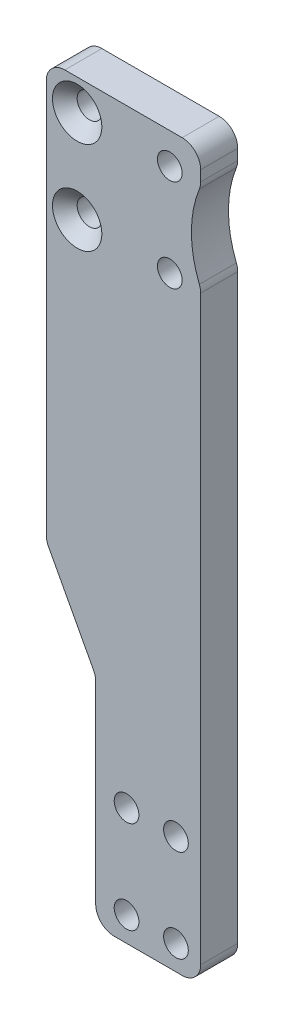
ISO-10303-21;
HEADER;
FILE_DESCRIPTION(('STEP AP214'),'2;1');
FILE_NAME('part.step','',(''),(''),'','','');
FILE_SCHEMA(('AUTOMOTIVE_DESIGN { 1 0 10303 214 1 1 1 1 }'));
ENDSEC;
DATA;
#1=APPLICATION_CONTEXT('core data for automotive mechanical design processes');
#2=APPLICATION_PROTOCOL_DEFINITION('international standard','automotive_design',2000,#1);
#3=PRODUCT_CONTEXT('',#1,'mechanical');
#4=PRODUCT('Part','Part','',(#3));
#5=PRODUCT_RELATED_PRODUCT_CATEGORY('part','',(#4));
#6=PRODUCT_DEFINITION_FORMATION('','',#4);
#7=PRODUCT_DEFINITION_CONTEXT('part definition',#1,'design');
#8=PRODUCT_DEFINITION('design','',#6,#7);
#9=PRODUCT_DEFINITION_SHAPE('','',#8);
#10=(LENGTH_UNIT() NAMED_UNIT(*) SI_UNIT(.MILLI.,.METRE.));
#11=(NAMED_UNIT(*) PLANE_ANGLE_UNIT() SI_UNIT($,.RADIAN.));
#12=(NAMED_UNIT(*) SI_UNIT($,.STERADIAN.) SOLID_ANGLE_UNIT());
#13=UNCERTAINTY_MEASURE_WITH_UNIT(LENGTH_MEASURE(1.E-05),#10,'distance_accuracy_value','');
#14=(GEOMETRIC_REPRESENTATION_CONTEXT(3) GLOBAL_UNCERTAINTY_ASSIGNED_CONTEXT((#13)) GLOBAL_UNIT_ASSIGNED_CONTEXT((#10,
#11,#12)) REPRESENTATION_CONTEXT('',''));
#15=CARTESIAN_POINT('',(0.,0.,0.));
#16=DIRECTION('',(0.,0.,1.));
#17=DIRECTION('',(1.,0.,0.));
#18=AXIS2_PLACEMENT_3D('',#15,#16,#17);
#19=CARTESIAN_POINT('',(0.,0.,6.));
#20=DIRECTION('',(0.,0.,1.));
#21=DIRECTION('',(1.,0.,0.));
#22=AXIS2_PLACEMENT_3D('',#19,#20,#21);
#23=PLANE('',#22);
#24=CARTESIAN_POINT('',(-2.00000000000001,107.5,6.));
#25=DIRECTION('',(0.,0.,1.));
#26=DIRECTION('',(1.,0.,0.));
#27=AXIS2_PLACEMENT_3D('',#24,#25,#26);
#28=CIRCLE('',#27,4.00000000000003);
#29=CARTESIAN_POINT('',(2.00000000000002,107.5,6.));
#30=VERTEX_POINT('',#29);
#31=EDGE_CURVE('E92',#30,#30,#28,.F.);
#32=ORIENTED_EDGE('',*,*,#31,.T.);
#33=EDGE_LOOP('',(#32));
#34=FACE_BOUND('',#33,.T.);
#35=CARTESIAN_POINT('',(-2.00000000000001,92.5,6.));
#36=DIRECTION('',(0.,0.,1.));
#37=DIRECTION('',(1.,0.,0.));
#38=AXIS2_PLACEMENT_3D('',#35,#36,#37);
#39=CIRCLE('',#38,4.00000000000003);
#40=CARTESIAN_POINT('',(2.00000000000002,92.5,6.));
#41=VERTEX_POINT('',#40);
#42=EDGE_CURVE('E326',#41,#41,#39,.F.);
#43=ORIENTED_EDGE('',*,*,#42,.T.);
#44=EDGE_LOOP('',(#43));
#45=FACE_BOUND('',#44,.T.);
#46=DIRECTION('',(0.,1.,0.));
#47=VECTOR('',#46,1.);
#48=CARTESIAN_POINT('',(0.999999999999982,30.,6.));
#49=LINE('',#48,#47);
#50=CARTESIAN_POINT('',(0.999999999999986,-1.99999999999999,6.));
#51=VERTEX_POINT('',#50);
#52=CARTESIAN_POINT('',(0.999999999999982,29.25,6.));
#53=VERTEX_POINT('',#52);
#54=EDGE_CURVE('E468',#51,#53,#49,.T.);
#55=ORIENTED_EDGE('',*,*,#54,.F.);
#56=CARTESIAN_POINT('',(3.99999999999999,-1.99999999999999,6.));
#57=DIRECTION('',(0.,0.,1.));
#58=DIRECTION('',(1.,0.,0.));
#59=AXIS2_PLACEMENT_3D('',#56,#57,#58);
#60=CIRCLE('',#59,3.);
#61=CARTESIAN_POINT('',(3.99999999999999,-5.,6.));
#62=VERTEX_POINT('',#61);
#63=EDGE_CURVE('E306',#51,#62,#60,.T.);
#64=ORIENTED_EDGE('',*,*,#63,.T.);
#65=DIRECTION('',(1.,0.,0.));
#66=VECTOR('',#65,1.);
#67=CARTESIAN_POINT('',(0.,-5.,6.));
#68=LINE('',#67,#66);
#69=CARTESIAN_POINT('',(15.,-5.,6.));
#70=VERTEX_POINT('',#69);
#71=EDGE_CURVE('E252',#62,#70,#68,.T.);
#72=ORIENTED_EDGE('',*,*,#71,.T.);
#73=CARTESIAN_POINT('',(15.,-2.,6.));
#74=DIRECTION('',(0.,0.,1.));
#75=DIRECTION('',(1.,0.,0.));
#76=AXIS2_PLACEMENT_3D('',#73,#74,#75);
#77=CIRCLE('',#76,3.);
#78=CARTESIAN_POINT('',(18.,-1.99999999999999,6.));
#79=VERTEX_POINT('',#78);
#80=EDGE_CURVE('E266',#70,#79,#77,.T.);
#81=ORIENTED_EDGE('',*,*,#80,.T.);
#82=DIRECTION('',(0.,-1.,0.));
#83=VECTOR('',#82,1.);
#84=CARTESIAN_POINT('',(18.,0.,6.));
#85=LINE('',#84,#83);
#86=CARTESIAN_POINT('',(18.,92.20577136594,6.));
#87=VERTEX_POINT('',#86);
#88=EDGE_CURVE('E243',#87,#79,#85,.T.);
#89=ORIENTED_EDGE('',*,*,#88,.F.);
#90=CARTESIAN_POINT('',(15.,92.20577136594,6.));
#91=DIRECTION('',(0.,0.,1.));
#92=DIRECTION('',(1.,0.,0.));
#93=AXIS2_PLACEMENT_3D('',#90,#91,#92);
#94=CIRCLE('',#93,3.);
#95=CARTESIAN_POINT('',(17.7857142857143,93.3192325993771,6.));
#96=VERTEX_POINT('',#95);
#97=EDGE_CURVE('E268',#87,#96,#94,.T.);
#98=ORIENTED_EDGE('',*,*,#97,.T.);
#99=CARTESIAN_POINT('',(34.5,100.,6.));
#100=DIRECTION('',(0.,0.,1.));
#101=DIRECTION('',(1.,0.,0.));
#102=AXIS2_PLACEMENT_3D('',#99,#100,#101);
#103=CIRCLE('',#102,18.);
#104=CARTESIAN_POINT('',(17.7857142857143,106.680767400623,6.));
#105=VERTEX_POINT('',#104);
#106=EDGE_CURVE('E442',#105,#96,#103,.T.);
#107=ORIENTED_EDGE('',*,*,#106,.F.);
#108=CARTESIAN_POINT('',(15.,107.79422863406,6.));
#109=DIRECTION('',(0.,0.,1.));
#110=DIRECTION('',(1.,0.,0.));
#111=AXIS2_PLACEMENT_3D('',#108,#109,#110);
#112=CIRCLE('',#111,3.);
#113=CARTESIAN_POINT('',(18.,107.79422863406,6.));
#114=VERTEX_POINT('',#113);
#115=EDGE_CURVE('E270',#105,#114,#112,.T.);
#116=ORIENTED_EDGE('',*,*,#115,.T.);
#117=CARTESIAN_POINT('',(18.,109.5,6.));
#118=VERTEX_POINT('',#117);
#119=EDGE_CURVE('E430',#118,#114,#85,.T.);
#120=ORIENTED_EDGE('',*,*,#119,.F.);
#121=CARTESIAN_POINT('',(15.,109.5,6.));
#122=DIRECTION('',(0.,0.,1.));
#123=DIRECTION('',(1.,0.,0.));
#124=AXIS2_PLACEMENT_3D('',#121,#122,#123);
#125=CIRCLE('',#124,3.);
#126=CARTESIAN_POINT('',(15.,112.5,6.));
#127=VERTEX_POINT('',#126);
#128=EDGE_CURVE('E264',#118,#127,#125,.T.);
#129=ORIENTED_EDGE('',*,*,#128,.T.);
#130=DIRECTION('',(1.,0.,0.));
#131=VECTOR('',#130,1.);
#132=CARTESIAN_POINT('',(0.,112.5,6.));
#133=LINE('',#132,#131);
#134=CARTESIAN_POINT('',(-4.00000000000001,112.5,6.));
#135=VERTEX_POINT('',#134);
#136=EDGE_CURVE('E425',#135,#127,#133,.T.);
#137=ORIENTED_EDGE('',*,*,#136,.F.);
#138=CARTESIAN_POINT('',(-4.00000000000001,109.5,6.));
#139=DIRECTION('',(0.,0.,1.));
#140=DIRECTION('',(1.,0.,0.));
#141=AXIS2_PLACEMENT_3D('',#138,#139,#140);
#142=CIRCLE('',#141,3.);
#143=CARTESIAN_POINT('',(-7.00000000000001,109.5,6.));
#144=VERTEX_POINT('',#143);
#145=EDGE_CURVE('E272',#135,#144,#142,.T.);
#146=ORIENTED_EDGE('',*,*,#145,.T.);
#147=DIRECTION('',(0.,-1.,0.));
#148=VECTOR('',#147,1.);
#149=CARTESIAN_POINT('',(-7.,0.,6.));
#150=LINE('',#149,#148);
#151=CARTESIAN_POINT('',(-7.,45.75,6.));
#152=VERTEX_POINT('',#151);
#153=EDGE_CURVE('E218',#144,#152,#150,.T.);
#154=ORIENTED_EDGE('',*,*,#153,.T.);
#155=CARTESIAN_POINT('',(-4.,45.75,6.));
#156=DIRECTION('',(0.,0.,1.));
#157=DIRECTION('',(1.,0.,0.));
#158=AXIS2_PLACEMENT_3D('',#155,#156,#157);
#159=CIRCLE('',#158,3.);
#160=CARTESIAN_POINT('',(-6.64705882352942,44.3382352941176,6.));
#161=VERTEX_POINT('',#160);
#162=EDGE_CURVE('E304',#152,#161,#159,.T.);
#163=ORIENTED_EDGE('',*,*,#162,.T.);
#164=DIRECTION('',(-0.470588235294117,0.882352941176471,0.));
#165=VECTOR('',#164,1.);
#166=CARTESIAN_POINT('',(-7.00000000000001,45.,6.));
#167=LINE('',#166,#165);
#168=CARTESIAN_POINT('',(0.647058823529396,30.6617647058824,6.));
#169=VERTEX_POINT('',#168);
#170=EDGE_CURVE('E476',#169,#161,#167,.T.);
#171=ORIENTED_EDGE('',*,*,#170,.F.);
#172=CARTESIAN_POINT('',(-2.00000000000002,29.25,6.));
#173=DIRECTION('',(0.,0.,1.));
#174=DIRECTION('',(1.,0.,0.));
#175=AXIS2_PLACEMENT_3D('',#172,#173,#174);
#176=CIRCLE('',#175,3.);
#177=EDGE_CURVE('E319',#169,#53,#176,.F.);
#178=ORIENTED_EDGE('',*,*,#177,.T.);
#179=EDGE_LOOP('',(#55,#64,#72,#81,#89,#98,#107,#116,#120,#129,#137,#146,#154,#163,#171,#178));
#180=FACE_BOUND('',#179,.T.);
#181=CARTESIAN_POINT('',(14.,14.,6.));
#182=DIRECTION('',(0.,0.,1.));
#183=DIRECTION('',(1.,0.,0.));
#184=AXIS2_PLACEMENT_3D('',#181,#182,#183);
#185=CIRCLE('',#184,2.);
#186=CARTESIAN_POINT('',(16.,14.,6.));
#187=VERTEX_POINT('',#186);
#188=EDGE_CURVE('E296',#187,#187,#185,.T.);
#189=ORIENTED_EDGE('',*,*,#188,.F.);
#190=EDGE_LOOP('',(#189));
#191=FACE_BOUND('',#190,.T.);
#192=CARTESIAN_POINT('',(14.,-0.999999999999995,6.));
#193=DIRECTION('',(0.,0.,1.));
#194=DIRECTION('',(1.,0.,0.));
#195=AXIS2_PLACEMENT_3D('',#192,#193,#194);
#196=CIRCLE('',#195,2.);
#197=CARTESIAN_POINT('',(16.,-0.999999999999995,6.));
#198=VERTEX_POINT('',#197);
#199=EDGE_CURVE('E474',#198,#198,#196,.T.);
#200=ORIENTED_EDGE('',*,*,#199,.F.);
#201=EDGE_LOOP('',(#200));
#202=FACE_BOUND('',#201,.T.);
#203=CARTESIAN_POINT('',(5.99999999999999,14.,6.));
#204=DIRECTION('',(0.,0.,1.));
#205=DIRECTION('',(1.,0.,0.));
#206=AXIS2_PLACEMENT_3D('',#203,#204,#205);
#207=CIRCLE('',#206,2.);
#208=CARTESIAN_POINT('',(7.99999999999999,14.,6.));
#209=VERTEX_POINT('',#208);
#210=EDGE_CURVE('E299',#209,#209,#207,.T.);
#211=ORIENTED_EDGE('',*,*,#210,.F.);
#212=EDGE_LOOP('',(#211));
#213=FACE_BOUND('',#212,.T.);
#214=CARTESIAN_POINT('',(5.99999999999999,-0.999999999999996,6.));
#215=DIRECTION('',(0.,0.,1.));
#216=DIRECTION('',(1.,0.,0.));
#217=AXIS2_PLACEMENT_3D('',#214,#215,#216);
#218=CIRCLE('',#217,2.);
#219=CARTESIAN_POINT('',(7.99999999999999,-0.999999999999996,6.));
#220=VERTEX_POINT('',#219);
#221=EDGE_CURVE('E250',#220,#220,#218,.T.);
#222=ORIENTED_EDGE('',*,*,#221,.F.);
#223=EDGE_LOOP('',(#222));
#224=FACE_BOUND('',#223,.T.);
#225=CARTESIAN_POINT('',(13.,107.5,6.));
#226=DIRECTION('',(0.,0.,1.));
#227=DIRECTION('',(1.,0.,0.));
#228=AXIS2_PLACEMENT_3D('',#225,#226,#227);
#229=CIRCLE('',#228,2.00000000000001);
#230=CARTESIAN_POINT('',(15.,107.5,6.));
#231=VERTEX_POINT('',#230);
#232=EDGE_CURVE('E424',#231,#231,#229,.T.);
#233=ORIENTED_EDGE('',*,*,#232,.F.);
#234=EDGE_LOOP('',(#233));
#235=FACE_BOUND('',#234,.T.);
#236=CARTESIAN_POINT('',(13.,92.5,6.));
#237=DIRECTION('',(0.,0.,1.));
#238=DIRECTION('',(1.,0.,0.));
#239=AXIS2_PLACEMENT_3D('',#236,#237,#238);
#240=CIRCLE('',#239,2.00000000000001);
#241=CARTESIAN_POINT('',(15.,92.5,6.));
#242=VERTEX_POINT('',#241);
#243=EDGE_CURVE('E245',#242,#242,#240,.T.);
#244=ORIENTED_EDGE('',*,*,#243,.F.);
#245=EDGE_LOOP('',(#244));
#246=FACE_BOUND('',#245,.T.);
#247=ADVANCED_FACE('F83',(#34,#45,#180,#191,#202,#213,#224,#235,#246),#23,.T.);
#248=CARTESIAN_POINT('',(0.,0.,0.));
#249=DIRECTION('',(0.,0.,1.));
#250=DIRECTION('',(1.,0.,0.));
#251=AXIS2_PLACEMENT_3D('',#248,#249,#250);
#252=PLANE('',#251);
#253=CARTESIAN_POINT('',(14.,14.,0.));
#254=DIRECTION('',(0.,0.,1.));
#255=DIRECTION('',(1.,0.,0.));
#256=AXIS2_PLACEMENT_3D('',#253,#254,#255);
#257=CIRCLE('',#256,2.);
#258=CARTESIAN_POINT('',(16.,14.,0.));
#259=VERTEX_POINT('',#258);
#260=EDGE_CURVE('E295',#259,#259,#257,.T.);
#261=ORIENTED_EDGE('',*,*,#260,.T.);
#262=EDGE_LOOP('',(#261));
#263=FACE_BOUND('',#262,.T.);
#264=CARTESIAN_POINT('',(14.,-0.999999999999995,0.));
#265=DIRECTION('',(0.,0.,1.));
#266=DIRECTION('',(1.,0.,0.));
#267=AXIS2_PLACEMENT_3D('',#264,#265,#266);
#268=CIRCLE('',#267,2.);
#269=CARTESIAN_POINT('',(16.,-0.999999999999995,0.));
#270=VERTEX_POINT('',#269);
#271=EDGE_CURVE('E292',#270,#270,#268,.T.);
#272=ORIENTED_EDGE('',*,*,#271,.T.);
#273=EDGE_LOOP('',(#272));
#274=FACE_BOUND('',#273,.T.);
#275=CARTESIAN_POINT('',(5.99999999999999,14.,0.));
#276=DIRECTION('',(0.,0.,1.));
#277=DIRECTION('',(1.,0.,0.));
#278=AXIS2_PLACEMENT_3D('',#275,#276,#277);
#279=CIRCLE('',#278,2.);
#280=CARTESIAN_POINT('',(7.99999999999999,14.,0.));
#281=VERTEX_POINT('',#280);
#282=EDGE_CURVE('E249',#281,#281,#279,.T.);
#283=ORIENTED_EDGE('',*,*,#282,.T.);
#284=EDGE_LOOP('',(#283));
#285=FACE_BOUND('',#284,.T.);
#286=CARTESIAN_POINT('',(5.99999999999999,-0.999999999999996,0.));
#287=DIRECTION('',(0.,0.,1.));
#288=DIRECTION('',(1.,0.,0.));
#289=AXIS2_PLACEMENT_3D('',#286,#287,#288);
#290=CIRCLE('',#289,2.);
#291=CARTESIAN_POINT('',(7.99999999999999,-0.999999999999996,0.));
#292=VERTEX_POINT('',#291);
#293=EDGE_CURVE('E246',#292,#292,#290,.T.);
#294=ORIENTED_EDGE('',*,*,#293,.T.);
#295=EDGE_LOOP('',(#294));
#296=FACE_BOUND('',#295,.T.);
#297=DIRECTION('',(1.,0.,0.));
#298=VECTOR('',#297,1.);
#299=CARTESIAN_POINT('',(0.,-5.,0.));
#300=LINE('',#299,#298);
#301=CARTESIAN_POINT('',(3.99999999999999,-5.,0.));
#302=VERTEX_POINT('',#301);
#303=CARTESIAN_POINT('',(15.,-5.,0.));
#304=VERTEX_POINT('',#303);
#305=EDGE_CURVE('E220',#302,#304,#300,.T.);
#306=ORIENTED_EDGE('',*,*,#305,.F.);
#307=CARTESIAN_POINT('',(3.99999999999999,-1.99999999999999,0.));
#308=DIRECTION('',(0.,0.,1.));
#309=DIRECTION('',(1.,0.,0.));
#310=AXIS2_PLACEMENT_3D('',#307,#308,#309);
#311=CIRCLE('',#310,3.);
#312=CARTESIAN_POINT('',(0.999999999999986,-2.,0.));
#313=VERTEX_POINT('',#312);
#314=EDGE_CURVE('E311',#302,#313,#311,.F.);
#315=ORIENTED_EDGE('',*,*,#314,.T.);
#316=DIRECTION('',(0.,1.,0.));
#317=VECTOR('',#316,1.);
#318=CARTESIAN_POINT('',(0.999999999999985,0.,0.));
#319=LINE('',#318,#317);
#320=CARTESIAN_POINT('',(0.999999999999982,29.25,0.));
#321=VERTEX_POINT('',#320);
#322=EDGE_CURVE('E470',#313,#321,#319,.T.);
#323=ORIENTED_EDGE('',*,*,#322,.T.);
#324=CARTESIAN_POINT('',(-2.00000000000002,29.25,0.));
#325=DIRECTION('',(0.,0.,1.));
#326=DIRECTION('',(1.,0.,0.));
#327=AXIS2_PLACEMENT_3D('',#324,#325,#326);
#328=CIRCLE('',#327,3.);
#329=CARTESIAN_POINT('',(0.647058823529395,30.6617647058824,0.));
#330=VERTEX_POINT('',#329);
#331=EDGE_CURVE('E321',#321,#330,#328,.T.);
#332=ORIENTED_EDGE('',*,*,#331,.T.);
#333=DIRECTION('',(-0.470588235294117,0.882352941176471,0.));
#334=VECTOR('',#333,1.);
#335=CARTESIAN_POINT('',(13.235294117647,7.05882352941175,0.));
#336=LINE('',#335,#334);
#337=CARTESIAN_POINT('',(-6.64705882352942,44.3382352941176,0.));
#338=VERTEX_POINT('',#337);
#339=EDGE_CURVE('E472',#330,#338,#336,.T.);
#340=ORIENTED_EDGE('',*,*,#339,.T.);
#341=CARTESIAN_POINT('',(-4.,45.75,0.));
#342=DIRECTION('',(0.,0.,1.));
#343=DIRECTION('',(1.,0.,0.));
#344=AXIS2_PLACEMENT_3D('',#341,#342,#343);
#345=CIRCLE('',#344,3.);
#346=CARTESIAN_POINT('',(-7.,45.75,0.));
#347=VERTEX_POINT('',#346);
#348=EDGE_CURVE('E99',#338,#347,#345,.F.);
#349=ORIENTED_EDGE('',*,*,#348,.T.);
#350=DIRECTION('',(0.,-1.,0.));
#351=VECTOR('',#350,1.);
#352=CARTESIAN_POINT('',(-7.,0.,0.));
#353=LINE('',#352,#351);
#354=CARTESIAN_POINT('',(-7.00000000000001,109.5,0.));
#355=VERTEX_POINT('',#354);
#356=EDGE_CURVE('E215',#355,#347,#353,.T.);
#357=ORIENTED_EDGE('',*,*,#356,.F.);
#358=CARTESIAN_POINT('',(-4.00000000000001,109.5,0.));
#359=DIRECTION('',(0.,0.,1.));
#360=DIRECTION('',(1.,0.,0.));
#361=AXIS2_PLACEMENT_3D('',#358,#359,#360);
#362=CIRCLE('',#361,3.);
#363=CARTESIAN_POINT('',(-4.00000000000001,112.5,0.));
#364=VERTEX_POINT('',#363);
#365=EDGE_CURVE('E200',#355,#364,#362,.F.);
#366=ORIENTED_EDGE('',*,*,#365,.T.);
#367=DIRECTION('',(1.,0.,0.));
#368=VECTOR('',#367,1.);
#369=CARTESIAN_POINT('',(0.,112.5,0.));
#370=LINE('',#369,#368);
#371=CARTESIAN_POINT('',(15.,112.5,0.));
#372=VERTEX_POINT('',#371);
#373=EDGE_CURVE('E226',#364,#372,#370,.T.);
#374=ORIENTED_EDGE('',*,*,#373,.T.);
#375=CARTESIAN_POINT('',(15.,109.5,0.));
#376=DIRECTION('',(0.,0.,1.));
#377=DIRECTION('',(1.,0.,0.));
#378=AXIS2_PLACEMENT_3D('',#375,#376,#377);
#379=CIRCLE('',#378,3.);
#380=CARTESIAN_POINT('',(18.,109.5,0.));
#381=VERTEX_POINT('',#380);
#382=EDGE_CURVE('E219',#372,#381,#379,.F.);
#383=ORIENTED_EDGE('',*,*,#382,.T.);
#384=DIRECTION('',(0.,-1.,0.));
#385=VECTOR('',#384,1.);
#386=CARTESIAN_POINT('',(18.,0.,0.));
#387=LINE('',#386,#385);
#388=CARTESIAN_POINT('',(18.,107.79422863406,0.));
#389=VERTEX_POINT('',#388);
#390=EDGE_CURVE('E231',#381,#389,#387,.T.);
#391=ORIENTED_EDGE('',*,*,#390,.T.);
#392=CARTESIAN_POINT('',(15.,107.79422863406,0.));
#393=DIRECTION('',(0.,0.,1.));
#394=DIRECTION('',(1.,0.,0.));
#395=AXIS2_PLACEMENT_3D('',#392,#393,#394);
#396=CIRCLE('',#395,3.);
#397=CARTESIAN_POINT('',(17.7857142857143,106.680767400623,0.));
#398=VERTEX_POINT('',#397);
#399=EDGE_CURVE('E209',#389,#398,#396,.F.);
#400=ORIENTED_EDGE('',*,*,#399,.T.);
#401=CARTESIAN_POINT('',(34.5,100.,0.));
#402=DIRECTION('',(0.,0.,1.));
#403=DIRECTION('',(1.,0.,0.));
#404=AXIS2_PLACEMENT_3D('',#401,#402,#403);
#405=CIRCLE('',#404,18.);
#406=CARTESIAN_POINT('',(17.7857142857143,93.3192325993771,0.));
#407=VERTEX_POINT('',#406);
#408=EDGE_CURVE('E437',#398,#407,#405,.T.);
#409=ORIENTED_EDGE('',*,*,#408,.T.);
#410=CARTESIAN_POINT('',(15.,92.20577136594,0.));
#411=DIRECTION('',(0.,0.,1.));
#412=DIRECTION('',(1.,0.,0.));
#413=AXIS2_PLACEMENT_3D('',#410,#411,#412);
#414=CIRCLE('',#413,3.);
#415=CARTESIAN_POINT('',(18.,92.20577136594,0.));
#416=VERTEX_POINT('',#415);
#417=EDGE_CURVE('E258',#407,#416,#414,.F.);
#418=ORIENTED_EDGE('',*,*,#417,.T.);
#419=CARTESIAN_POINT('',(18.,-1.99999999999999,0.));
#420=VERTEX_POINT('',#419);
#421=EDGE_CURVE('E435',#416,#420,#387,.T.);
#422=ORIENTED_EDGE('',*,*,#421,.T.);
#423=CARTESIAN_POINT('',(15.,-2.,0.));
#424=DIRECTION('',(0.,0.,1.));
#425=DIRECTION('',(1.,0.,0.));
#426=AXIS2_PLACEMENT_3D('',#423,#424,#425);
#427=CIRCLE('',#426,3.);
#428=EDGE_CURVE('E255',#420,#304,#427,.F.);
#429=ORIENTED_EDGE('',*,*,#428,.T.);
#430=EDGE_LOOP('',(#306,#315,#323,#332,#340,#349,#357,#366,#374,#383,#391,#400,#409,#418,#422,#429));
#431=FACE_BOUND('',#430,.T.);
#432=CARTESIAN_POINT('',(13.,107.5,0.));
#433=DIRECTION('',(0.,0.,1.));
#434=DIRECTION('',(1.,0.,0.));
#435=AXIS2_PLACEMENT_3D('',#432,#433,#434);
#436=CIRCLE('',#435,2.00000000000001);
#437=CARTESIAN_POINT('',(15.,107.5,0.));
#438=VERTEX_POINT('',#437);
#439=EDGE_CURVE('E225',#438,#438,#436,.T.);
#440=ORIENTED_EDGE('',*,*,#439,.T.);
#441=EDGE_LOOP('',(#440));
#442=FACE_BOUND('',#441,.T.);
#443=CARTESIAN_POINT('',(13.,92.5,0.));
#444=DIRECTION('',(0.,0.,1.));
#445=DIRECTION('',(1.,0.,0.));
#446=AXIS2_PLACEMENT_3D('',#443,#444,#445);
#447=CIRCLE('',#446,2.00000000000001);
#448=CARTESIAN_POINT('',(15.,92.5,0.));
#449=VERTEX_POINT('',#448);
#450=EDGE_CURVE('E229',#449,#449,#447,.T.);
#451=ORIENTED_EDGE('',*,*,#450,.T.);
#452=EDGE_LOOP('',(#451));
#453=FACE_BOUND('',#452,.T.);
#454=CARTESIAN_POINT('',(-2.00000000000001,92.5,0.));
#455=DIRECTION('',(0.,0.,1.));
#456=DIRECTION('',(1.,0.,0.));
#457=AXIS2_PLACEMENT_3D('',#454,#455,#456);
#458=CIRCLE('',#457,2.00000000000001);
#459=CARTESIAN_POINT('',(0.,92.5,0.));
#460=VERTEX_POINT('',#459);
#461=EDGE_CURVE('E237',#460,#460,#458,.T.);
#462=ORIENTED_EDGE('',*,*,#461,.T.);
#463=EDGE_LOOP('',(#462));
#464=FACE_BOUND('',#463,.T.);
#465=CARTESIAN_POINT('',(-2.00000000000001,107.5,0.));
#466=DIRECTION('',(0.,0.,1.));
#467=DIRECTION('',(1.,0.,0.));
#468=AXIS2_PLACEMENT_3D('',#465,#466,#467);
#469=CIRCLE('',#468,2.00000000000001);
#470=CARTESIAN_POINT('',(0.,107.5,0.));
#471=VERTEX_POINT('',#470);
#472=EDGE_CURVE('E240',#471,#471,#469,.T.);
#473=ORIENTED_EDGE('',*,*,#472,.T.);
#474=EDGE_LOOP('',(#473));
#475=FACE_BOUND('',#474,.T.);
#476=ADVANCED_FACE('F223',(#263,#274,#285,#296,#431,#442,#453,#464,#475),#252,.F.);
#477=CARTESIAN_POINT('',(18.,0.,6.));
#478=DIRECTION('',(1.,0.,0.));
#479=DIRECTION('',(0.,1.,0.));
#480=AXIS2_PLACEMENT_3D('',#477,#478,#479);
#481=PLANE('',#480);
#482=ORIENTED_EDGE('',*,*,#119,.T.);
#483=DIRECTION('',(0.,0.,-1.));
#484=VECTOR('',#483,1.);
#485=CARTESIAN_POINT('',(18.,107.79422863406,0.));
#486=LINE('',#485,#484);
#487=EDGE_CURVE('E282',#114,#389,#486,.T.);
#488=ORIENTED_EDGE('',*,*,#487,.T.);
#489=ORIENTED_EDGE('',*,*,#390,.F.);
#490=DIRECTION('',(0.,0.,-1.));
#491=VECTOR('',#490,1.);
#492=CARTESIAN_POINT('',(18.,109.5,6.));
#493=LINE('',#492,#491);
#494=EDGE_CURVE('E280',#381,#118,#493,.F.);
#495=ORIENTED_EDGE('',*,*,#494,.T.);
#496=EDGE_LOOP('',(#482,#488,#489,#495));
#497=FACE_BOUND('',#496,.T.);
#498=ADVANCED_FACE('F347',(#497),#481,.T.);
#499=ORIENTED_EDGE('',*,*,#421,.F.);
#500=DIRECTION('',(0.,0.,-1.));
#501=VECTOR('',#500,1.);
#502=CARTESIAN_POINT('',(18.,92.20577136594,6.));
#503=LINE('',#502,#501);
#504=EDGE_CURVE('E286',#416,#87,#503,.F.);
#505=ORIENTED_EDGE('',*,*,#504,.T.);
#506=ORIENTED_EDGE('',*,*,#88,.T.);
#507=DIRECTION('',(0.,0.,1.));
#508=VECTOR('',#507,1.);
#509=CARTESIAN_POINT('',(18.,-1.99999999999999,6.));
#510=LINE('',#509,#508);
#511=EDGE_CURVE('E284',#79,#420,#510,.F.);
#512=ORIENTED_EDGE('',*,*,#511,.T.);
#513=EDGE_LOOP('',(#499,#505,#506,#512));
#514=FACE_BOUND('',#513,.T.);
#515=ADVANCED_FACE('F354',(#514),#481,.T.);
#516=CARTESIAN_POINT('',(0.,112.5,6.));
#517=DIRECTION('',(0.,1.,0.));
#518=DIRECTION('',(-1.,0.,0.));
#519=AXIS2_PLACEMENT_3D('',#516,#517,#518);
#520=PLANE('',#519);
#521=ORIENTED_EDGE('',*,*,#373,.F.);
#522=DIRECTION('',(0.,0.,-1.));
#523=VECTOR('',#522,1.);
#524=CARTESIAN_POINT('',(-4.00000000000001,112.5,6.));
#525=LINE('',#524,#523);
#526=EDGE_CURVE('E205',#364,#135,#525,.F.);
#527=ORIENTED_EDGE('',*,*,#526,.T.);
#528=ORIENTED_EDGE('',*,*,#136,.T.);
#529=DIRECTION('',(0.,0.,-1.));
#530=VECTOR('',#529,1.);
#531=CARTESIAN_POINT('',(15.,112.5,6.));
#532=LINE('',#531,#530);
#533=EDGE_CURVE('E208',#127,#372,#532,.T.);
#534=ORIENTED_EDGE('',*,*,#533,.T.);
#535=EDGE_LOOP('',(#521,#527,#528,#534));
#536=FACE_BOUND('',#535,.T.);
#537=ADVANCED_FACE('F375',(#536),#520,.T.);
#538=CARTESIAN_POINT('',(-7.,0.,6.));
#539=DIRECTION('',(1.,0.,0.));
#540=DIRECTION('',(0.,1.,0.));
#541=AXIS2_PLACEMENT_3D('',#538,#539,#540);
#542=PLANE('',#541);
#543=ORIENTED_EDGE('',*,*,#356,.T.);
#544=DIRECTION('',(0.,0.,1.));
#545=VECTOR('',#544,1.);
#546=CARTESIAN_POINT('',(-7.,45.75,6.));
#547=LINE('',#546,#545);
#548=EDGE_CURVE('E317',#347,#152,#547,.T.);
#549=ORIENTED_EDGE('',*,*,#548,.T.);
#550=ORIENTED_EDGE('',*,*,#153,.F.);
#551=DIRECTION('',(0.,0.,-1.));
#552=VECTOR('',#551,1.);
#553=CARTESIAN_POINT('',(-7.00000000000001,109.5,0.));
#554=LINE('',#553,#552);
#555=EDGE_CURVE('E204',#144,#355,#554,.T.);
#556=ORIENTED_EDGE('',*,*,#555,.T.);
#557=EDGE_LOOP('',(#543,#549,#550,#556));
#558=FACE_BOUND('',#557,.T.);
#559=ADVANCED_FACE('F213',(#558),#542,.F.);
#560=CARTESIAN_POINT('',(-2.00000000000001,107.5,6.));
#561=DIRECTION('',(0.,0.,-1.));
#562=DIRECTION('',(-1.,0.,0.));
#563=AXIS2_PLACEMENT_3D('',#560,#561,#562);
#564=CYLINDRICAL_SURFACE('',#563,2.00000000000001);
#565=CARTESIAN_POINT('',(-2.00000000000001,107.5,3.99999999999998));
#566=DIRECTION('',(0.,0.,1.));
#567=DIRECTION('',(1.,0.,0.));
#568=AXIS2_PLACEMENT_3D('',#565,#566,#567);
#569=CIRCLE('',#568,2.00000000000001);
#570=CARTESIAN_POINT('',(0.,107.5,3.99999999999998));
#571=VERTEX_POINT('',#570);
#572=EDGE_CURVE('E323',#571,#571,#569,.T.);
#573=ORIENTED_EDGE('',*,*,#572,.T.);
#574=EDGE_LOOP('',(#573));
#575=FACE_BOUND('',#574,.T.);
#576=ORIENTED_EDGE('',*,*,#472,.F.);
#577=EDGE_LOOP('',(#576));
#578=FACE_BOUND('',#577,.T.);
#579=ADVANCED_FACE('F339',(#575,#578),#564,.F.);
#580=CARTESIAN_POINT('',(-2.00000000000001,92.5,6.));
#581=DIRECTION('',(0.,0.,-1.));
#582=DIRECTION('',(-1.,0.,0.));
#583=AXIS2_PLACEMENT_3D('',#580,#581,#582);
#584=CYLINDRICAL_SURFACE('',#583,2.00000000000001);
#585=CARTESIAN_POINT('',(-2.00000000000001,92.5,3.99999999999998));
#586=DIRECTION('',(0.,0.,1.));
#587=DIRECTION('',(1.,0.,0.));
#588=AXIS2_PLACEMENT_3D('',#585,#586,#587);
#589=CIRCLE('',#588,2.00000000000001);
#590=CARTESIAN_POINT('',(0.,92.5,3.99999999999998));
#591=VERTEX_POINT('',#590);
#592=EDGE_CURVE('E12',#591,#591,#589,.T.);
#593=ORIENTED_EDGE('',*,*,#592,.T.);
#594=EDGE_LOOP('',(#593));
#595=FACE_BOUND('',#594,.T.);
#596=ORIENTED_EDGE('',*,*,#461,.F.);
#597=EDGE_LOOP('',(#596));
#598=FACE_BOUND('',#597,.T.);
#599=ADVANCED_FACE('F342',(#595,#598),#584,.F.);
#600=CARTESIAN_POINT('',(13.,92.5,6.));
#601=DIRECTION('',(0.,0.,-1.));
#602=DIRECTION('',(-1.,0.,0.));
#603=AXIS2_PLACEMENT_3D('',#600,#601,#602);
#604=CYLINDRICAL_SURFACE('',#603,2.00000000000001);
#605=ORIENTED_EDGE('',*,*,#243,.T.);
#606=EDGE_LOOP('',(#605));
#607=FACE_BOUND('',#606,.T.);
#608=ORIENTED_EDGE('',*,*,#450,.F.);
#609=EDGE_LOOP('',(#608));
#610=FACE_BOUND('',#609,.T.);
#611=ADVANCED_FACE('F363',(#607,#610),#604,.F.);
#612=CARTESIAN_POINT('',(13.,107.5,6.));
#613=DIRECTION('',(0.,0.,-1.));
#614=DIRECTION('',(-1.,0.,0.));
#615=AXIS2_PLACEMENT_3D('',#612,#613,#614);
#616=CYLINDRICAL_SURFACE('',#615,2.00000000000001);
#617=ORIENTED_EDGE('',*,*,#232,.T.);
#618=EDGE_LOOP('',(#617));
#619=FACE_BOUND('',#618,.T.);
#620=ORIENTED_EDGE('',*,*,#439,.F.);
#621=EDGE_LOOP('',(#620));
#622=FACE_BOUND('',#621,.T.);
#623=ADVANCED_FACE('F367',(#619,#622),#616,.F.);
#624=CARTESIAN_POINT('',(34.5,100.,0.));
#625=DIRECTION('',(0.,0.,1.));
#626=DIRECTION('',(1.,0.,0.));
#627=AXIS2_PLACEMENT_3D('',#624,#625,#626);
#628=CYLINDRICAL_SURFACE('',#627,18.);
#629=ORIENTED_EDGE('',*,*,#408,.F.);
#630=DIRECTION('',(0.,0.,1.));
#631=VECTOR('',#630,1.);
#632=CARTESIAN_POINT('',(17.7857142857143,106.680767400623,0.));
#633=LINE('',#632,#631);
#634=EDGE_CURVE('E277',#398,#105,#633,.T.);
#635=ORIENTED_EDGE('',*,*,#634,.T.);
#636=ORIENTED_EDGE('',*,*,#106,.T.);
#637=DIRECTION('',(0.,0.,1.));
#638=VECTOR('',#637,1.);
#639=CARTESIAN_POINT('',(17.7857142857143,93.3192325993771,0.));
#640=LINE('',#639,#638);
#641=EDGE_CURVE('E274',#96,#407,#640,.F.);
#642=ORIENTED_EDGE('',*,*,#641,.T.);
#643=EDGE_LOOP('',(#629,#635,#636,#642));
#644=FACE_BOUND('',#643,.T.);
#645=ADVANCED_FACE('F371',(#644),#628,.F.);
#646=CARTESIAN_POINT('',(0.,-5.,-4.));
#647=DIRECTION('',(0.,-1.,0.));
#648=DIRECTION('',(0.,0.,-1.));
#649=AXIS2_PLACEMENT_3D('',#646,#647,#648);
#650=PLANE('',#649);
#651=ORIENTED_EDGE('',*,*,#71,.F.);
#652=DIRECTION('',(0.,0.,1.));
#653=VECTOR('',#652,1.);
#654=CARTESIAN_POINT('',(3.99999999999999,-5.,0.));
#655=LINE('',#654,#653);
#656=EDGE_CURVE('E308',#62,#302,#655,.F.);
#657=ORIENTED_EDGE('',*,*,#656,.T.);
#658=ORIENTED_EDGE('',*,*,#305,.T.);
#659=DIRECTION('',(0.,0.,1.));
#660=VECTOR('',#659,1.);
#661=CARTESIAN_POINT('',(15.,-5.,-4.));
#662=LINE('',#661,#660);
#663=EDGE_CURVE('E288',#304,#70,#662,.T.);
#664=ORIENTED_EDGE('',*,*,#663,.T.);
#665=EDGE_LOOP('',(#651,#657,#658,#664));
#666=FACE_BOUND('',#665,.T.);
#667=ADVANCED_FACE('F504',(#666),#650,.T.);
#668=CARTESIAN_POINT('',(5.99999999999999,-0.999999999999996,-4.));
#669=DIRECTION('',(0.,0.,1.));
#670=DIRECTION('',(1.,0.,0.));
#671=AXIS2_PLACEMENT_3D('',#668,#669,#670);
#672=CYLINDRICAL_SURFACE('',#671,2.);
#673=ORIENTED_EDGE('',*,*,#221,.T.);
#674=EDGE_LOOP('',(#673));
#675=FACE_BOUND('',#674,.T.);
#676=ORIENTED_EDGE('',*,*,#293,.F.);
#677=EDGE_LOOP('',(#676));
#678=FACE_BOUND('',#677,.T.);
#679=ADVANCED_FACE('F488',(#675,#678),#672,.F.);
#680=CARTESIAN_POINT('',(5.99999999999999,14.,-4.));
#681=DIRECTION('',(0.,0.,1.));
#682=DIRECTION('',(1.,0.,0.));
#683=AXIS2_PLACEMENT_3D('',#680,#681,#682);
#684=CYLINDRICAL_SURFACE('',#683,2.);
#685=ORIENTED_EDGE('',*,*,#210,.T.);
#686=EDGE_LOOP('',(#685));
#687=FACE_BOUND('',#686,.T.);
#688=ORIENTED_EDGE('',*,*,#282,.F.);
#689=EDGE_LOOP('',(#688));
#690=FACE_BOUND('',#689,.T.);
#691=ADVANCED_FACE('F384',(#687,#690),#684,.F.);
#692=CARTESIAN_POINT('',(-4.00000000000001,109.5,6.));
#693=DIRECTION('',(0.,0.,1.));
#694=DIRECTION('',(1.,0.,0.));
#695=AXIS2_PLACEMENT_3D('',#692,#693,#694);
#696=CYLINDRICAL_SURFACE('',#695,3.);
#697=ORIENTED_EDGE('',*,*,#145,.F.);
#698=ORIENTED_EDGE('',*,*,#526,.F.);
#699=ORIENTED_EDGE('',*,*,#365,.F.);
#700=ORIENTED_EDGE('',*,*,#555,.F.);
#701=EDGE_LOOP('',(#697,#698,#699,#700));
#702=FACE_BOUND('',#701,.T.);
#703=ADVANCED_FACE('F203',(#702),#696,.T.);
#704=CARTESIAN_POINT('',(15.,107.79422863406,0.));
#705=DIRECTION('',(0.,0.,1.));
#706=DIRECTION('',(1.,0.,0.));
#707=AXIS2_PLACEMENT_3D('',#704,#705,#706);
#708=CYLINDRICAL_SURFACE('',#707,3.);
#709=ORIENTED_EDGE('',*,*,#399,.F.);
#710=ORIENTED_EDGE('',*,*,#487,.F.);
#711=ORIENTED_EDGE('',*,*,#115,.F.);
#712=ORIENTED_EDGE('',*,*,#634,.F.);
#713=EDGE_LOOP('',(#709,#710,#711,#712));
#714=FACE_BOUND('',#713,.T.);
#715=ADVANCED_FACE('F383',(#714),#708,.T.);
#716=CARTESIAN_POINT('',(15.,92.20577136594,0.));
#717=DIRECTION('',(0.,0.,1.));
#718=DIRECTION('',(1.,0.,0.));
#719=AXIS2_PLACEMENT_3D('',#716,#717,#718);
#720=CYLINDRICAL_SURFACE('',#719,3.);
#721=ORIENTED_EDGE('',*,*,#97,.F.);
#722=ORIENTED_EDGE('',*,*,#504,.F.);
#723=ORIENTED_EDGE('',*,*,#417,.F.);
#724=ORIENTED_EDGE('',*,*,#641,.F.);
#725=EDGE_LOOP('',(#721,#722,#723,#724));
#726=FACE_BOUND('',#725,.T.);
#727=ADVANCED_FACE('F387',(#726),#720,.T.);
#728=CARTESIAN_POINT('',(15.,-2.,-4.));
#729=DIRECTION('',(0.,0.,1.));
#730=DIRECTION('',(1.,0.,0.));
#731=AXIS2_PLACEMENT_3D('',#728,#729,#730);
#732=CYLINDRICAL_SURFACE('',#731,3.);
#733=ORIENTED_EDGE('',*,*,#428,.F.);
#734=ORIENTED_EDGE('',*,*,#511,.F.);
#735=ORIENTED_EDGE('',*,*,#80,.F.);
#736=ORIENTED_EDGE('',*,*,#663,.F.);
#737=EDGE_LOOP('',(#733,#734,#735,#736));
#738=FACE_BOUND('',#737,.T.);
#739=ADVANCED_FACE('F391',(#738),#732,.T.);
#740=CARTESIAN_POINT('',(15.,109.5,6.));
#741=DIRECTION('',(0.,0.,-1.));
#742=DIRECTION('',(-1.,0.,0.));
#743=AXIS2_PLACEMENT_3D('',#740,#741,#742);
#744=CYLINDRICAL_SURFACE('',#743,3.);
#745=ORIENTED_EDGE('',*,*,#128,.F.);
#746=ORIENTED_EDGE('',*,*,#494,.F.);
#747=ORIENTED_EDGE('',*,*,#382,.F.);
#748=ORIENTED_EDGE('',*,*,#533,.F.);
#749=EDGE_LOOP('',(#745,#746,#747,#748));
#750=FACE_BOUND('',#749,.T.);
#751=ADVANCED_FACE('F395',(#750),#744,.T.);
#752=CARTESIAN_POINT('',(14.,-0.999999999999995,-4.));
#753=DIRECTION('',(0.,0.,1.));
#754=DIRECTION('',(1.,0.,0.));
#755=AXIS2_PLACEMENT_3D('',#752,#753,#754);
#756=CYLINDRICAL_SURFACE('',#755,2.);
#757=ORIENTED_EDGE('',*,*,#199,.T.);
#758=EDGE_LOOP('',(#757));
#759=FACE_BOUND('',#758,.T.);
#760=ORIENTED_EDGE('',*,*,#271,.F.);
#761=EDGE_LOOP('',(#760));
#762=FACE_BOUND('',#761,.T.);
#763=ADVANCED_FACE('F399',(#759,#762),#756,.F.);
#764=CARTESIAN_POINT('',(14.,14.,-4.));
#765=DIRECTION('',(0.,0.,1.));
#766=DIRECTION('',(1.,0.,0.));
#767=AXIS2_PLACEMENT_3D('',#764,#765,#766);
#768=CYLINDRICAL_SURFACE('',#767,2.);
#769=ORIENTED_EDGE('',*,*,#188,.T.);
#770=EDGE_LOOP('',(#769));
#771=FACE_BOUND('',#770,.T.);
#772=ORIENTED_EDGE('',*,*,#260,.F.);
#773=EDGE_LOOP('',(#772));
#774=FACE_BOUND('',#773,.T.);
#775=ADVANCED_FACE('F551',(#771,#774),#768,.F.);
#776=CARTESIAN_POINT('',(0.999999999999982,30.,-4.));
#777=DIRECTION('',(1.,0.,0.));
#778=DIRECTION('',(0.,1.,0.));
#779=AXIS2_PLACEMENT_3D('',#776,#777,#778);
#780=PLANE('',#779);
#781=ORIENTED_EDGE('',*,*,#322,.F.);
#782=DIRECTION('',(0.,0.,1.));
#783=VECTOR('',#782,1.);
#784=CARTESIAN_POINT('',(0.999999999999986,-2.,6.));
#785=LINE('',#784,#783);
#786=EDGE_CURVE('E301',#313,#51,#785,.T.);
#787=ORIENTED_EDGE('',*,*,#786,.T.);
#788=ORIENTED_EDGE('',*,*,#54,.T.);
#789=DIRECTION('',(0.,0.,1.));
#790=VECTOR('',#789,1.);
#791=CARTESIAN_POINT('',(0.999999999999982,29.25,0.));
#792=LINE('',#791,#790);
#793=EDGE_CURVE('E291',#53,#321,#792,.F.);
#794=ORIENTED_EDGE('',*,*,#793,.T.);
#795=EDGE_LOOP('',(#781,#787,#788,#794));
#796=FACE_BOUND('',#795,.T.);
#797=ADVANCED_FACE('F467',(#796),#780,.F.);
#798=CARTESIAN_POINT('',(-7.00000000000001,45.,-4.));
#799=DIRECTION('',(0.882352941176471,0.470588235294117,0.));
#800=DIRECTION('',(-0.470588235294117,0.882352941176471,0.));
#801=AXIS2_PLACEMENT_3D('',#798,#799,#800);
#802=PLANE('',#801);
#803=ORIENTED_EDGE('',*,*,#339,.F.);
#804=DIRECTION('',(0.,0.,1.));
#805=VECTOR('',#804,1.);
#806=CARTESIAN_POINT('',(0.647058823529397,30.6617647058824,6.));
#807=LINE('',#806,#805);
#808=EDGE_CURVE('E314',#330,#169,#807,.T.);
#809=ORIENTED_EDGE('',*,*,#808,.T.);
#810=ORIENTED_EDGE('',*,*,#170,.T.);
#811=DIRECTION('',(0.,0.,1.));
#812=VECTOR('',#811,1.);
#813=CARTESIAN_POINT('',(-6.64705882352942,44.3382352941176,-4.));
#814=LINE('',#813,#812);
#815=EDGE_CURVE('E107',#161,#338,#814,.F.);
#816=ORIENTED_EDGE('',*,*,#815,.T.);
#817=EDGE_LOOP('',(#803,#809,#810,#816));
#818=FACE_BOUND('',#817,.T.);
#819=ADVANCED_FACE('F405',(#818),#802,.F.);
#820=CARTESIAN_POINT('',(3.99999999999999,-1.99999999999999,-4.));
#821=DIRECTION('',(0.,0.,-1.));
#822=DIRECTION('',(-1.,0.,0.));
#823=AXIS2_PLACEMENT_3D('',#820,#821,#822);
#824=CYLINDRICAL_SURFACE('',#823,3.);
#825=ORIENTED_EDGE('',*,*,#314,.F.);
#826=ORIENTED_EDGE('',*,*,#656,.F.);
#827=ORIENTED_EDGE('',*,*,#63,.F.);
#828=ORIENTED_EDGE('',*,*,#786,.F.);
#829=EDGE_LOOP('',(#825,#826,#827,#828));
#830=FACE_BOUND('',#829,.T.);
#831=ADVANCED_FACE('F401',(#830),#824,.T.);
#832=CARTESIAN_POINT('',(-2.00000000000002,29.25,-4.));
#833=DIRECTION('',(0.,0.,-1.));
#834=DIRECTION('',(-1.,0.,0.));
#835=AXIS2_PLACEMENT_3D('',#832,#833,#834);
#836=CYLINDRICAL_SURFACE('',#835,3.);
#837=ORIENTED_EDGE('',*,*,#331,.F.);
#838=ORIENTED_EDGE('',*,*,#793,.F.);
#839=ORIENTED_EDGE('',*,*,#177,.F.);
#840=ORIENTED_EDGE('',*,*,#808,.F.);
#841=EDGE_LOOP('',(#837,#838,#839,#840));
#842=FACE_BOUND('',#841,.T.);
#843=ADVANCED_FACE('F404',(#842),#836,.F.);
#844=CARTESIAN_POINT('',(-4.,45.75,6.));
#845=DIRECTION('',(0.,0.,1.));
#846=DIRECTION('',(1.,0.,0.));
#847=AXIS2_PLACEMENT_3D('',#844,#845,#846);
#848=CYLINDRICAL_SURFACE('',#847,3.);
#849=ORIENTED_EDGE('',*,*,#348,.F.);
#850=ORIENTED_EDGE('',*,*,#815,.F.);
#851=ORIENTED_EDGE('',*,*,#162,.F.);
#852=ORIENTED_EDGE('',*,*,#548,.F.);
#853=EDGE_LOOP('',(#849,#850,#851,#852));
#854=FACE_BOUND('',#853,.T.);
#855=ADVANCED_FACE('F336',(#854),#848,.T.);
#856=CARTESIAN_POINT('',(-2.00000000000001,107.5,3.99999999999998));
#857=DIRECTION('',(0.,0.,1.));
#858=DIRECTION('',(1.,0.,0.));
#859=AXIS2_PLACEMENT_3D('',#856,#857,#858);
#860=CONICAL_SURFACE('',#859,2.00000000000001,0.78539816339745);
#861=ORIENTED_EDGE('',*,*,#31,.F.);
#862=EDGE_LOOP('',(#861));
#863=FACE_BOUND('',#862,.T.);
#864=ORIENTED_EDGE('',*,*,#572,.F.);
#865=EDGE_LOOP('',(#864));
#866=FACE_BOUND('',#865,.T.);
#867=ADVANCED_FACE('F333',(#863,#866),#860,.F.);
#868=CARTESIAN_POINT('',(-2.00000000000001,92.5,3.99999999999998));
#869=DIRECTION('',(0.,0.,1.));
#870=DIRECTION('',(1.,0.,0.));
#871=AXIS2_PLACEMENT_3D('',#868,#869,#870);
#872=CONICAL_SURFACE('',#871,2.00000000000001,0.78539816339745);
#873=ORIENTED_EDGE('',*,*,#42,.F.);
#874=EDGE_LOOP('',(#873));
#875=FACE_BOUND('',#874,.T.);
#876=ORIENTED_EDGE('',*,*,#592,.F.);
#877=EDGE_LOOP('',(#876));
#878=FACE_BOUND('',#877,.T.);
#879=ADVANCED_FACE('F86',(#875,#878),#872,.F.);
#880=CLOSED_SHELL('',(#247,#476,#498,#515,#537,#559,#579,#599,#611,#623,#645,#667,#679,#691,
#703,#715,#727,#739,#751,#763,#775,#797,#819,#831,#843,#855,#867,#879));
#881=MANIFOLD_SOLID_BREP('B2',#880);
#882=ADVANCED_BREP_SHAPE_REPRESENTATION('',(#18,#881),#14);
#883=SHAPE_DEFINITION_REPRESENTATION(#9,#882);
ENDSEC;
END-ISO-10303-21;
